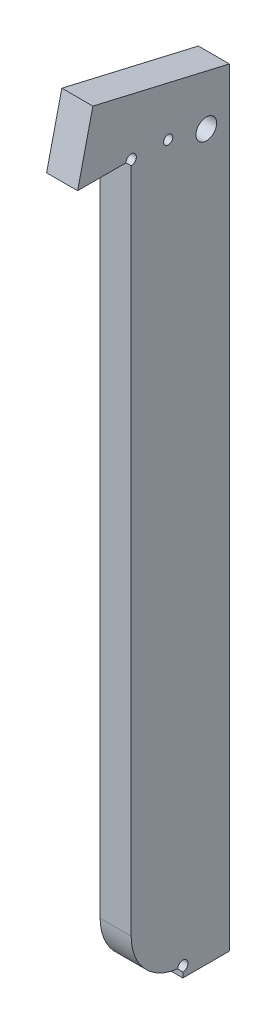
ISO-10303-21;
HEADER;
FILE_DESCRIPTION(('STEP AP214'),'2;1');
FILE_NAME('part.step','',(''),(''),'','','');
FILE_SCHEMA(('AUTOMOTIVE_DESIGN { 1 0 10303 214 1 1 1 1 }'));
ENDSEC;
DATA;
#1=APPLICATION_CONTEXT('core data for automotive mechanical design processes');
#2=APPLICATION_PROTOCOL_DEFINITION('international standard','automotive_design',2000,#1);
#3=PRODUCT_CONTEXT('',#1,'mechanical');
#4=PRODUCT('Part','Part','',(#3));
#5=PRODUCT_RELATED_PRODUCT_CATEGORY('part','',(#4));
#6=PRODUCT_DEFINITION_FORMATION('','',#4);
#7=PRODUCT_DEFINITION_CONTEXT('part definition',#1,'design');
#8=PRODUCT_DEFINITION('design','',#6,#7);
#9=PRODUCT_DEFINITION_SHAPE('','',#8);
#10=(LENGTH_UNIT() NAMED_UNIT(*) SI_UNIT(.MILLI.,.METRE.));
#11=(NAMED_UNIT(*) PLANE_ANGLE_UNIT() SI_UNIT($,.RADIAN.));
#12=(NAMED_UNIT(*) SI_UNIT($,.STERADIAN.) SOLID_ANGLE_UNIT());
#13=UNCERTAINTY_MEASURE_WITH_UNIT(LENGTH_MEASURE(1.E-05),#10,'distance_accuracy_value','');
#14=(GEOMETRIC_REPRESENTATION_CONTEXT(3) GLOBAL_UNCERTAINTY_ASSIGNED_CONTEXT((#13)) GLOBAL_UNIT_ASSIGNED_CONTEXT((#10,
#11,#12)) REPRESENTATION_CONTEXT('',''));
#15=CARTESIAN_POINT('',(0.,0.,0.));
#16=DIRECTION('',(0.,0.,1.));
#17=DIRECTION('',(1.,0.,0.));
#18=AXIS2_PLACEMENT_3D('',#15,#16,#17);
#19=CARTESIAN_POINT('',(-228.088766336441,1.77635683940025E-12,66.675));
#20=DIRECTION('',(1.,0.,0.));
#21=DIRECTION('',(0.,1.,0.));
#22=AXIS2_PLACEMENT_3D('',#19,#20,#21);
#23=PLANE('',#22);
#24=CARTESIAN_POINT('',(-228.088766336441,-0.660555348775778,37.5801252195676));
#25=DIRECTION('',(-1.,0.,0.));
#26=DIRECTION('',(0.,0.,1.));
#27=AXIS2_PLACEMENT_3D('',#24,#25,#26);
#28=CIRCLE('',#27,6.35000000000001);
#29=CARTESIAN_POINT('',(-228.088766336441,-0.660555348775778,43.9301252195676));
#30=VERTEX_POINT('',#29);
#31=EDGE_CURVE('E235',#30,#30,#28,.T.);
#32=ORIENTED_EDGE('',*,*,#31,.F.);
#33=EDGE_LOOP('',(#32));
#34=FACE_BOUND('',#33,.T.);
#35=CARTESIAN_POINT('',(-228.088766336441,-444.5,28.575));
#36=DIRECTION('',(-1.,0.,0.));
#37=DIRECTION('',(0.,0.,1.));
#38=AXIS2_PLACEMENT_3D('',#35,#36,#37);
#39=CIRCLE('',#38,3.17499999999998);
#40=CARTESIAN_POINT('',(-228.088766336441,-444.34125,31.7460287664258));
#41=VERTEX_POINT('',#40);
#42=CARTESIAN_POINT('',(-228.088766336441,-447.675,28.575));
#43=VERTEX_POINT('',#42);
#44=EDGE_CURVE('E121',#41,#43,#39,.T.);
#45=ORIENTED_EDGE('',*,*,#44,.F.);
#46=CARTESIAN_POINT('',(-228.088766336441,-412.75,28.575));
#47=DIRECTION('',(1.,0.,0.));
#48=DIRECTION('',(0.,-1.,0.));
#49=AXIS2_PLACEMENT_3D('',#46,#47,#48);
#50=CIRCLE('',#49,31.75);
#51=CARTESIAN_POINT('',(-228.088766336441,-412.75,60.325));
#52=VERTEX_POINT('',#51);
#53=EDGE_CURVE('E120',#52,#41,#50,.T.);
#54=ORIENTED_EDGE('',*,*,#53,.F.);
#55=DIRECTION('',(0.,-1.,0.));
#56=VECTOR('',#55,1.);
#57=CARTESIAN_POINT('',(-228.088766336441,1.77635683940025E-12,60.325));
#58=LINE('',#57,#56);
#59=CARTESIAN_POINT('',(-228.088766336441,-3.17500000000002,60.325));
#60=VERTEX_POINT('',#59);
#61=EDGE_CURVE('E129',#60,#52,#58,.T.);
#62=ORIENTED_EDGE('',*,*,#61,.F.);
#63=CARTESIAN_POINT('',(-228.088766336441,0.,60.325));
#64=DIRECTION('',(-1.,0.,0.));
#65=DIRECTION('',(0.,0.,1.));
#66=AXIS2_PLACEMENT_3D('',#63,#64,#65);
#67=CIRCLE('',#66,3.175);
#68=CARTESIAN_POINT('',(-228.088766336441,0.,63.5));
#69=VERTEX_POINT('',#68);
#70=EDGE_CURVE('E175',#69,#60,#67,.T.);
#71=ORIENTED_EDGE('',*,*,#70,.F.);
#72=DIRECTION('',(0.,0.,1.));
#73=VECTOR('',#72,1.);
#74=CARTESIAN_POINT('',(-228.088766336441,0.,93.1961939808879));
#75=LINE('',#74,#73);
#76=CARTESIAN_POINT('',(-228.088766336441,0.,93.1961939808879));
#77=VERTEX_POINT('',#76);
#78=EDGE_CURVE('E180',#69,#77,#75,.T.);
#79=ORIENTED_EDGE('',*,*,#78,.T.);
#80=DIRECTION('',(0.,0.974040610761285,-0.226373338950907));
#81=VECTOR('',#80,1.);
#82=CARTESIAN_POINT('',(-228.088766336441,40.3069419106757,83.8285999376698));
#83=LINE('',#82,#81);
#84=CARTESIAN_POINT('',(-228.088766336441,40.3069419106757,83.8285999376698));
#85=VERTEX_POINT('',#84);
#86=EDGE_CURVE('E183',#77,#85,#83,.T.);
#87=ORIENTED_EDGE('',*,*,#86,.T.);
#88=DIRECTION('',(0.,-0.22637333895091,-0.974040610761285));
#89=VECTOR('',#88,1.);
#90=CARTESIAN_POINT('',(-228.088766336441,34.8445532417902,60.325));
#91=LINE('',#90,#89);
#92=CARTESIAN_POINT('',(-228.088766336441,20.8246330030021,0.));
#93=VERTEX_POINT('',#92);
#94=EDGE_CURVE('E193',#85,#93,#91,.T.);
#95=ORIENTED_EDGE('',*,*,#94,.T.);
#96=DIRECTION('',(0.,-1.,0.));
#97=VECTOR('',#96,1.);
#98=CARTESIAN_POINT('',(-228.088766336441,1.77635683940025E-12,0.));
#99=LINE('',#98,#97);
#100=CARTESIAN_POINT('',(-228.088766336441,-450.85,0.));
#101=VERTEX_POINT('',#100);
#102=EDGE_CURVE('E141',#93,#101,#99,.T.);
#103=ORIENTED_EDGE('',*,*,#102,.T.);
#104=DIRECTION('',(0.,0.,-1.));
#105=VECTOR('',#104,1.);
#106=CARTESIAN_POINT('',(-228.088766336441,-450.85,66.675));
#107=LINE('',#106,#105);
#108=CARTESIAN_POINT('',(-228.088766336441,-450.85,28.575));
#109=VERTEX_POINT('',#108);
#110=EDGE_CURVE('E151',#109,#101,#107,.T.);
#111=ORIENTED_EDGE('',*,*,#110,.F.);
#112=DIRECTION('',(0.,-1.,0.));
#113=VECTOR('',#112,1.);
#114=CARTESIAN_POINT('',(-228.088766336441,-450.85,28.575));
#115=LINE('',#114,#113);
#116=EDGE_CURVE('E137',#43,#109,#115,.T.);
#117=ORIENTED_EDGE('',*,*,#116,.F.);
#118=EDGE_LOOP('',(#45,#54,#62,#71,#79,#87,#95,#103,#111,#117));
#119=FACE_BOUND('',#118,.T.);
#120=CARTESIAN_POINT('',(-228.088766336441,-6.64676298919709,14.175520602931));
#121=DIRECTION('',(-1.,0.,0.));
#122=DIRECTION('',(0.,0.,1.));
#123=AXIS2_PLACEMENT_3D('',#120,#121,#122);
#124=CIRCLE('',#123,6.34999999999999);
#125=CARTESIAN_POINT('',(-228.088766336441,-6.64676298919709,20.525520602931));
#126=VERTEX_POINT('',#125);
#127=EDGE_CURVE('E243',#126,#126,#124,.T.);
#128=ORIENTED_EDGE('',*,*,#127,.F.);
#129=EDGE_LOOP('',(#128));
#130=FACE_BOUND('',#129,.T.);
#131=ADVANCED_FACE('F33',(#34,#119,#130),#23,.F.);
#132=CARTESIAN_POINT('',(-228.088766336441,-450.85,66.675));
#133=DIRECTION('',(0.,1.,0.));
#134=DIRECTION('',(0.,0.,1.));
#135=AXIS2_PLACEMENT_3D('',#132,#133,#134);
#136=PLANE('',#135);
#137=DIRECTION('',(0.,0.,-1.));
#138=VECTOR('',#137,1.);
#139=CARTESIAN_POINT('',(-209.038766336441,-450.85,66.675));
#140=LINE('',#139,#138);
#141=CARTESIAN_POINT('',(-209.038766336441,-450.85,28.575));
#142=VERTEX_POINT('',#141);
#143=CARTESIAN_POINT('',(-209.038766336441,-450.85,0.));
#144=VERTEX_POINT('',#143);
#145=EDGE_CURVE('E149',#142,#144,#140,.T.);
#146=ORIENTED_EDGE('',*,*,#145,.F.);
#147=DIRECTION('',(1.,0.,0.));
#148=VECTOR('',#147,1.);
#149=CARTESIAN_POINT('',(-228.088766336441,-450.85,28.575));
#150=LINE('',#149,#148);
#151=EDGE_CURVE('E153',#142,#109,#150,.F.);
#152=ORIENTED_EDGE('',*,*,#151,.T.);
#153=ORIENTED_EDGE('',*,*,#110,.T.);
#154=DIRECTION('',(1.,0.,0.));
#155=VECTOR('',#154,1.);
#156=CARTESIAN_POINT('',(-228.088766336441,-450.85,0.));
#157=LINE('',#156,#155);
#158=EDGE_CURVE('E144',#101,#144,#157,.T.);
#159=ORIENTED_EDGE('',*,*,#158,.T.);
#160=EDGE_LOOP('',(#146,#152,#153,#159));
#161=FACE_BOUND('',#160,.T.);
#162=ADVANCED_FACE('F216',(#161),#136,.F.);
#163=CARTESIAN_POINT('',(-209.038766336441,0.,66.675));
#164=DIRECTION('',(-1.,0.,0.));
#165=DIRECTION('',(0.,-1.,0.));
#166=AXIS2_PLACEMENT_3D('',#163,#164,#165);
#167=PLANE('',#166);
#168=CARTESIAN_POINT('',(-209.038766336441,-6.64676298919709,14.175520602931));
#169=DIRECTION('',(-1.,0.,0.));
#170=DIRECTION('',(0.,-1.,0.));
#171=AXIS2_PLACEMENT_3D('',#168,#169,#170);
#172=CIRCLE('',#171,6.34999999999999);
#173=CARTESIAN_POINT('',(-209.038766336441,-12.9967629891971,14.175520602931));
#174=VERTEX_POINT('',#173);
#175=EDGE_CURVE('E238',#174,#174,#172,.T.);
#176=ORIENTED_EDGE('',*,*,#175,.T.);
#177=EDGE_LOOP('',(#176));
#178=FACE_BOUND('',#177,.T.);
#179=CARTESIAN_POINT('',(-209.038766336441,-0.660555348775778,37.5801252195676));
#180=DIRECTION('',(-1.,0.,0.));
#181=DIRECTION('',(0.,-1.,0.));
#182=AXIS2_PLACEMENT_3D('',#179,#180,#181);
#183=CIRCLE('',#182,2.80670000000001);
#184=CARTESIAN_POINT('',(-209.038766336441,-3.46725534877579,37.5801252195676));
#185=VERTEX_POINT('',#184);
#186=EDGE_CURVE('E167',#185,#185,#183,.T.);
#187=ORIENTED_EDGE('',*,*,#186,.T.);
#188=EDGE_LOOP('',(#187));
#189=FACE_BOUND('',#188,.T.);
#190=CARTESIAN_POINT('',(-209.038766336441,-412.75,28.575));
#191=DIRECTION('',(-1.,0.,0.));
#192=DIRECTION('',(0.,-1.,0.));
#193=AXIS2_PLACEMENT_3D('',#190,#191,#192);
#194=CIRCLE('',#193,31.75);
#195=CARTESIAN_POINT('',(-209.038766336441,-444.34125,31.7460287664258));
#196=VERTEX_POINT('',#195);
#197=CARTESIAN_POINT('',(-209.038766336441,-412.75,60.325));
#198=VERTEX_POINT('',#197);
#199=EDGE_CURVE('E117',#196,#198,#194,.T.);
#200=ORIENTED_EDGE('',*,*,#199,.F.);
#201=CARTESIAN_POINT('',(-209.038766336441,-444.5,28.575));
#202=DIRECTION('',(-1.,0.,0.));
#203=DIRECTION('',(0.,-1.,0.));
#204=AXIS2_PLACEMENT_3D('',#201,#202,#203);
#205=CIRCLE('',#204,3.17499999999998);
#206=CARTESIAN_POINT('',(-209.038766336441,-447.675,28.575));
#207=VERTEX_POINT('',#206);
#208=EDGE_CURVE('E11',#196,#207,#205,.T.);
#209=ORIENTED_EDGE('',*,*,#208,.T.);
#210=DIRECTION('',(0.,1.,0.));
#211=VECTOR('',#210,1.);
#212=CARTESIAN_POINT('',(-209.038766336441,-450.85,28.575));
#213=LINE('',#212,#211);
#214=EDGE_CURVE('E127',#142,#207,#213,.T.);
#215=ORIENTED_EDGE('',*,*,#214,.F.);
#216=ORIENTED_EDGE('',*,*,#145,.T.);
#217=DIRECTION('',(0.,1.,0.));
#218=VECTOR('',#217,1.);
#219=CARTESIAN_POINT('',(-209.038766336441,0.,0.));
#220=LINE('',#219,#218);
#221=CARTESIAN_POINT('',(-209.038766336441,20.8246330030021,0.));
#222=VERTEX_POINT('',#221);
#223=EDGE_CURVE('E147',#144,#222,#220,.T.);
#224=ORIENTED_EDGE('',*,*,#223,.T.);
#225=DIRECTION('',(0.,-0.22637333895091,-0.974040610761285));
#226=VECTOR('',#225,1.);
#227=CARTESIAN_POINT('',(-209.038766336441,34.8445532417902,60.325));
#228=LINE('',#227,#226);
#229=CARTESIAN_POINT('',(-209.038766336441,40.3069419106757,83.8285999376698));
#230=VERTEX_POINT('',#229);
#231=EDGE_CURVE('E196',#230,#222,#228,.T.);
#232=ORIENTED_EDGE('',*,*,#231,.F.);
#233=DIRECTION('',(0.,0.974040610761285,-0.226373338950907));
#234=VECTOR('',#233,1.);
#235=CARTESIAN_POINT('',(-209.038766336441,40.3069419106757,83.8285999376698));
#236=LINE('',#235,#234);
#237=CARTESIAN_POINT('',(-209.038766336441,0.,93.1961939808879));
#238=VERTEX_POINT('',#237);
#239=EDGE_CURVE('E182',#238,#230,#236,.T.);
#240=ORIENTED_EDGE('',*,*,#239,.F.);
#241=DIRECTION('',(0.,0.,1.));
#242=VECTOR('',#241,1.);
#243=CARTESIAN_POINT('',(-209.038766336441,0.,93.1961939808879));
#244=LINE('',#243,#242);
#245=CARTESIAN_POINT('',(-209.038766336441,8.23179834482838E-13,63.5));
#246=VERTEX_POINT('',#245);
#247=EDGE_CURVE('E157',#246,#238,#244,.T.);
#248=ORIENTED_EDGE('',*,*,#247,.F.);
#249=CARTESIAN_POINT('',(-209.038766336441,0.,60.325));
#250=DIRECTION('',(-1.,0.,0.));
#251=DIRECTION('',(0.,-1.,0.));
#252=AXIS2_PLACEMENT_3D('',#249,#250,#251);
#253=CIRCLE('',#252,3.175);
#254=CARTESIAN_POINT('',(-209.038766336441,-3.17500000000002,60.325));
#255=VERTEX_POINT('',#254);
#256=EDGE_CURVE('E40',#246,#255,#253,.T.);
#257=ORIENTED_EDGE('',*,*,#256,.T.);
#258=DIRECTION('',(0.,1.,0.));
#259=VECTOR('',#258,1.);
#260=CARTESIAN_POINT('',(-209.038766336441,1.77870238100157E-12,60.325));
#261=LINE('',#260,#259);
#262=EDGE_CURVE('E126',#198,#255,#261,.T.);
#263=ORIENTED_EDGE('',*,*,#262,.F.);
#264=EDGE_LOOP('',(#200,#209,#215,#216,#224,#232,#240,#248,#257,#263));
#265=FACE_BOUND('',#264,.T.);
#266=ADVANCED_FACE('F124',(#178,#189,#265),#167,.F.);
#267=CARTESIAN_POINT('',(0.,0.,0.));
#268=DIRECTION('',(0.,0.,1.));
#269=DIRECTION('',(1.,0.,0.));
#270=AXIS2_PLACEMENT_3D('',#267,#268,#269);
#271=PLANE('',#270);
#272=ORIENTED_EDGE('',*,*,#102,.F.);
#273=DIRECTION('',(-1.,0.,0.));
#274=VECTOR('',#273,1.);
#275=CARTESIAN_POINT('',(-209.038766336441,20.8246330030021,0.));
#276=LINE('',#275,#274);
#277=EDGE_CURVE('E131',#222,#93,#276,.T.);
#278=ORIENTED_EDGE('',*,*,#277,.F.);
#279=ORIENTED_EDGE('',*,*,#223,.F.);
#280=ORIENTED_EDGE('',*,*,#158,.F.);
#281=EDGE_LOOP('',(#272,#278,#279,#280));
#282=FACE_BOUND('',#281,.T.);
#283=ADVANCED_FACE('F214',(#282),#271,.F.);
#284=CARTESIAN_POINT('',(-209.037766336441,-450.85,28.575));
#285=DIRECTION('',(0.,0.,-1.));
#286=DIRECTION('',(0.,1.,0.));
#287=AXIS2_PLACEMENT_3D('',#284,#285,#286);
#288=PLANE('',#287);
#289=ORIENTED_EDGE('',*,*,#214,.T.);
#290=DIRECTION('',(-1.,0.,0.));
#291=VECTOR('',#290,1.);
#292=CARTESIAN_POINT('',(-228.088766336441,-447.675,28.575));
#293=LINE('',#292,#291);
#294=EDGE_CURVE('E47',#207,#43,#293,.T.);
#295=ORIENTED_EDGE('',*,*,#294,.T.);
#296=ORIENTED_EDGE('',*,*,#116,.T.);
#297=ORIENTED_EDGE('',*,*,#151,.F.);
#298=EDGE_LOOP('',(#289,#295,#296,#297));
#299=FACE_BOUND('',#298,.T.);
#300=ADVANCED_FACE('F218',(#299),#288,.F.);
#301=CARTESIAN_POINT('',(-209.037766336441,-412.75,28.575));
#302=DIRECTION('',(-1.,0.,0.));
#303=DIRECTION('',(0.,-1.,0.));
#304=AXIS2_PLACEMENT_3D('',#301,#302,#303);
#305=CYLINDRICAL_SURFACE('',#304,31.75);
#306=ORIENTED_EDGE('',*,*,#53,.T.);
#307=DIRECTION('',(-1.,0.,0.));
#308=VECTOR('',#307,1.);
#309=CARTESIAN_POINT('',(-218.563766336441,-444.34125,31.7460287664258));
#310=LINE('',#309,#308);
#311=EDGE_CURVE('E107',#41,#196,#310,.F.);
#312=ORIENTED_EDGE('',*,*,#311,.T.);
#313=ORIENTED_EDGE('',*,*,#199,.T.);
#314=DIRECTION('',(-1.,0.,0.));
#315=VECTOR('',#314,1.);
#316=CARTESIAN_POINT('',(-209.037766336441,-412.75,60.325));
#317=LINE('',#316,#315);
#318=EDGE_CURVE('E139',#198,#52,#317,.T.);
#319=ORIENTED_EDGE('',*,*,#318,.T.);
#320=EDGE_LOOP('',(#306,#312,#313,#319));
#321=FACE_BOUND('',#320,.T.);
#322=ADVANCED_FACE('F115',(#321),#305,.T.);
#323=CARTESIAN_POINT('',(-209.037766336441,1.77870250412711E-12,60.325));
#324=DIRECTION('',(0.,0.,-1.));
#325=DIRECTION('',(0.,1.,0.));
#326=AXIS2_PLACEMENT_3D('',#323,#324,#325);
#327=PLANE('',#326);
#328=ORIENTED_EDGE('',*,*,#262,.T.);
#329=DIRECTION('',(-1.,0.,0.));
#330=VECTOR('',#329,1.);
#331=CARTESIAN_POINT('',(-228.088766336441,-3.17500000000002,60.325));
#332=LINE('',#331,#330);
#333=EDGE_CURVE('E54',#255,#60,#332,.T.);
#334=ORIENTED_EDGE('',*,*,#333,.T.);
#335=ORIENTED_EDGE('',*,*,#61,.T.);
#336=ORIENTED_EDGE('',*,*,#318,.F.);
#337=EDGE_LOOP('',(#328,#334,#335,#336));
#338=FACE_BOUND('',#337,.T.);
#339=ADVANCED_FACE('F160',(#338),#327,.F.);
#340=CARTESIAN_POINT('',(-209.038766336441,34.8445532417902,60.325));
#341=DIRECTION('',(0.,0.974040610761285,-0.22637333895091));
#342=DIRECTION('',(0.,0.22637333895091,0.974040610761285));
#343=AXIS2_PLACEMENT_3D('',#340,#341,#342);
#344=PLANE('',#343);
#345=ORIENTED_EDGE('',*,*,#94,.F.);
#346=DIRECTION('',(-1.,0.,0.));
#347=VECTOR('',#346,1.);
#348=CARTESIAN_POINT('',(-209.038766336441,40.3069419106757,83.8285999376698));
#349=LINE('',#348,#347);
#350=EDGE_CURVE('E190',#230,#85,#349,.T.);
#351=ORIENTED_EDGE('',*,*,#350,.F.);
#352=ORIENTED_EDGE('',*,*,#231,.T.);
#353=ORIENTED_EDGE('',*,*,#277,.T.);
#354=EDGE_LOOP('',(#345,#351,#352,#353));
#355=FACE_BOUND('',#354,.T.);
#356=ADVANCED_FACE('F203',(#355),#344,.T.);
#357=CARTESIAN_POINT('',(-209.038766336441,40.3069419106757,83.8285999376698));
#358=DIRECTION('',(0.,0.226373338950907,0.974040610761285));
#359=DIRECTION('',(0.,-0.974040610761285,0.226373338950907));
#360=AXIS2_PLACEMENT_3D('',#357,#358,#359);
#361=PLANE('',#360);
#362=ORIENTED_EDGE('',*,*,#86,.F.);
#363=DIRECTION('',(-1.,0.,0.));
#364=VECTOR('',#363,1.);
#365=CARTESIAN_POINT('',(-209.038766336441,0.,93.1961939808879));
#366=LINE('',#365,#364);
#367=EDGE_CURVE('E186',#238,#77,#366,.T.);
#368=ORIENTED_EDGE('',*,*,#367,.F.);
#369=ORIENTED_EDGE('',*,*,#239,.T.);
#370=ORIENTED_EDGE('',*,*,#350,.T.);
#371=EDGE_LOOP('',(#362,#368,#369,#370));
#372=FACE_BOUND('',#371,.T.);
#373=ADVANCED_FACE('F211',(#372),#361,.T.);
#374=CARTESIAN_POINT('',(-209.038766336441,0.,93.1961939808879));
#375=DIRECTION('',(0.,-1.,0.));
#376=DIRECTION('',(0.,0.,-1.));
#377=AXIS2_PLACEMENT_3D('',#374,#375,#376);
#378=PLANE('',#377);
#379=DIRECTION('',(-1.,0.,0.));
#380=VECTOR('',#379,1.);
#381=CARTESIAN_POINT('',(-228.088766336441,8.20834292881518E-13,63.5));
#382=LINE('',#381,#380);
#383=EDGE_CURVE('E178',#246,#69,#382,.T.);
#384=ORIENTED_EDGE('',*,*,#383,.F.);
#385=ORIENTED_EDGE('',*,*,#247,.T.);
#386=ORIENTED_EDGE('',*,*,#367,.T.);
#387=ORIENTED_EDGE('',*,*,#78,.F.);
#388=EDGE_LOOP('',(#384,#385,#386,#387));
#389=FACE_BOUND('',#388,.T.);
#390=ADVANCED_FACE('F275',(#389),#378,.T.);
#391=CARTESIAN_POINT('',(-228.088766336441,0.,60.325));
#392=DIRECTION('',(-1.,0.,0.));
#393=DIRECTION('',(0.,0.,1.));
#394=AXIS2_PLACEMENT_3D('',#391,#392,#393);
#395=CYLINDRICAL_SURFACE('',#394,3.175);
#396=ORIENTED_EDGE('',*,*,#383,.T.);
#397=ORIENTED_EDGE('',*,*,#70,.T.);
#398=ORIENTED_EDGE('',*,*,#333,.F.);
#399=ORIENTED_EDGE('',*,*,#256,.F.);
#400=EDGE_LOOP('',(#396,#397,#398,#399));
#401=FACE_BOUND('',#400,.T.);
#402=ADVANCED_FACE('F272',(#401),#395,.F.);
#403=CARTESIAN_POINT('',(-228.088766336441,-444.5,28.575));
#404=DIRECTION('',(-1.,0.,0.));
#405=DIRECTION('',(0.,0.,1.));
#406=AXIS2_PLACEMENT_3D('',#403,#404,#405);
#407=CYLINDRICAL_SURFACE('',#406,3.17499999999998);
#408=ORIENTED_EDGE('',*,*,#208,.F.);
#409=ORIENTED_EDGE('',*,*,#311,.F.);
#410=ORIENTED_EDGE('',*,*,#44,.T.);
#411=ORIENTED_EDGE('',*,*,#294,.F.);
#412=EDGE_LOOP('',(#408,#409,#410,#411));
#413=FACE_BOUND('',#412,.T.);
#414=ADVANCED_FACE('F106',(#413),#407,.F.);
#415=CARTESIAN_POINT('',(-228.088766336441,-0.660555348775778,37.5801252195676));
#416=DIRECTION('',(-1.,0.,0.));
#417=DIRECTION('',(0.,0.,1.));
#418=AXIS2_PLACEMENT_3D('',#415,#416,#417);
#419=CYLINDRICAL_SURFACE('',#418,2.80670000000001);
#420=ORIENTED_EDGE('',*,*,#186,.F.);
#421=EDGE_LOOP('',(#420));
#422=FACE_BOUND('',#421,.T.);
#423=CARTESIAN_POINT('',(-221.738766336441,-0.660555348775778,37.5801252195676));
#424=DIRECTION('',(-1.,0.,0.));
#425=DIRECTION('',(0.,0.,1.));
#426=AXIS2_PLACEMENT_3D('',#423,#424,#425);
#427=CIRCLE('',#426,2.80670000000001);
#428=CARTESIAN_POINT('',(-221.738766336441,-0.660555348775778,40.3868252195676));
#429=VERTEX_POINT('',#428);
#430=EDGE_CURVE('E170',#429,#429,#427,.T.);
#431=ORIENTED_EDGE('',*,*,#430,.T.);
#432=EDGE_LOOP('',(#431));
#433=FACE_BOUND('',#432,.T.);
#434=ADVANCED_FACE('F249',(#422,#433),#419,.F.);
#435=CARTESIAN_POINT('',(-221.738766336441,2.14614465122423,37.5801252195676));
#436=DIRECTION('',(1.,0.,0.));
#437=DIRECTION('',(0.,0.,-1.));
#438=AXIS2_PLACEMENT_3D('',#435,#436,#437);
#439=PLANE('',#438);
#440=ORIENTED_EDGE('',*,*,#430,.F.);
#441=EDGE_LOOP('',(#440));
#442=FACE_BOUND('',#441,.T.);
#443=CARTESIAN_POINT('',(-221.738766336441,-0.660555348775778,37.5801252195676));
#444=DIRECTION('',(-1.,0.,0.));
#445=DIRECTION('',(0.,0.,1.));
#446=AXIS2_PLACEMENT_3D('',#443,#444,#445);
#447=CIRCLE('',#446,6.35000000000001);
#448=CARTESIAN_POINT('',(-221.738766336441,-0.660555348775778,43.9301252195676));
#449=VERTEX_POINT('',#448);
#450=EDGE_CURVE('E237',#449,#449,#447,.T.);
#451=ORIENTED_EDGE('',*,*,#450,.T.);
#452=EDGE_LOOP('',(#451));
#453=FACE_BOUND('',#452,.T.);
#454=ADVANCED_FACE('F251',(#442,#453),#439,.F.);
#455=CARTESIAN_POINT('',(-228.088766336441,-0.660555348775778,37.5801252195676));
#456=DIRECTION('',(-1.,0.,0.));
#457=DIRECTION('',(0.,0.,1.));
#458=AXIS2_PLACEMENT_3D('',#455,#456,#457);
#459=CYLINDRICAL_SURFACE('',#458,6.35000000000001);
#460=ORIENTED_EDGE('',*,*,#450,.F.);
#461=EDGE_LOOP('',(#460));
#462=FACE_BOUND('',#461,.T.);
#463=ORIENTED_EDGE('',*,*,#31,.T.);
#464=EDGE_LOOP('',(#463));
#465=FACE_BOUND('',#464,.T.);
#466=ADVANCED_FACE('F254',(#462,#465),#459,.F.);
#467=CARTESIAN_POINT('',(-228.088766336441,-6.64676298919709,14.175520602931));
#468=DIRECTION('',(-1.,0.,0.));
#469=DIRECTION('',(0.,0.,1.));
#470=AXIS2_PLACEMENT_3D('',#467,#468,#469);
#471=CYLINDRICAL_SURFACE('',#470,6.34999999999999);
#472=ORIENTED_EDGE('',*,*,#175,.F.);
#473=EDGE_LOOP('',(#472));
#474=FACE_BOUND('',#473,.T.);
#475=ORIENTED_EDGE('',*,*,#127,.T.);
#476=EDGE_LOOP('',(#475));
#477=FACE_BOUND('',#476,.T.);
#478=ADVANCED_FACE('F259',(#474,#477),#471,.F.);
#479=CLOSED_SHELL('',(#131,#162,#266,#283,#300,#322,#339,#356,#373,#390,#402,#414,#434,#454,
#466,#478));
#480=MANIFOLD_SOLID_BREP('B2',#479);
#481=ADVANCED_BREP_SHAPE_REPRESENTATION('',(#18,#480),#14);
#482=SHAPE_DEFINITION_REPRESENTATION(#9,#481);
ENDSEC;
END-ISO-10303-21;
